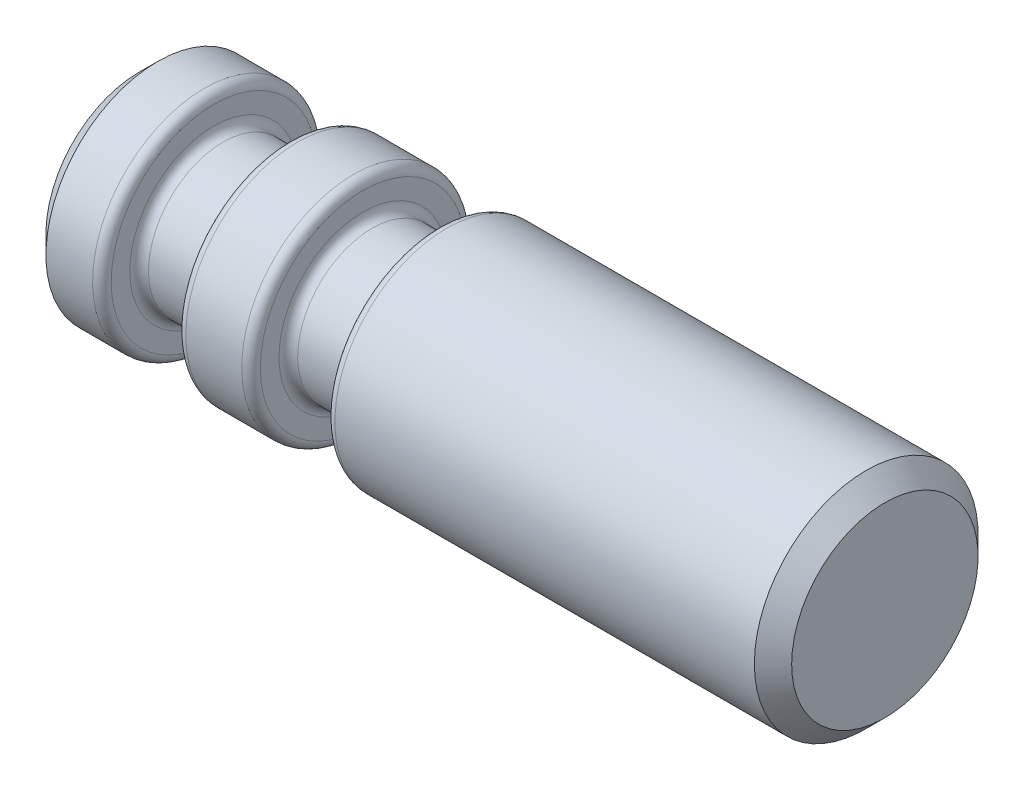
ISO-10303-21;
HEADER;
FILE_DESCRIPTION(('STEP AP214'),'2;1');
FILE_NAME('part.step','',(''),(''),'','','');
FILE_SCHEMA(('AUTOMOTIVE_DESIGN { 1 0 10303 214 1 1 1 1 }'));
ENDSEC;
DATA;
#1=APPLICATION_CONTEXT('core data for automotive mechanical design processes');
#2=APPLICATION_PROTOCOL_DEFINITION('international standard','automotive_design',2000,#1);
#3=PRODUCT_CONTEXT('',#1,'mechanical');
#4=PRODUCT('Part','Part','',(#3));
#5=PRODUCT_RELATED_PRODUCT_CATEGORY('part','',(#4));
#6=PRODUCT_DEFINITION_FORMATION('','',#4);
#7=PRODUCT_DEFINITION_CONTEXT('part definition',#1,'design');
#8=PRODUCT_DEFINITION('design','',#6,#7);
#9=PRODUCT_DEFINITION_SHAPE('','',#8);
#10=(LENGTH_UNIT() NAMED_UNIT(*) SI_UNIT(.MILLI.,.METRE.));
#11=(NAMED_UNIT(*) PLANE_ANGLE_UNIT() SI_UNIT($,.RADIAN.));
#12=(NAMED_UNIT(*) SI_UNIT($,.STERADIAN.) SOLID_ANGLE_UNIT());
#13=UNCERTAINTY_MEASURE_WITH_UNIT(LENGTH_MEASURE(1.E-05),#10,'distance_accuracy_value','');
#14=(GEOMETRIC_REPRESENTATION_CONTEXT(3) GLOBAL_UNCERTAINTY_ASSIGNED_CONTEXT((#13)) GLOBAL_UNIT_ASSIGNED_CONTEXT((#10,
#11,#12)) REPRESENTATION_CONTEXT('',''));
#15=CARTESIAN_POINT('',(0.,0.,0.));
#16=DIRECTION('',(0.,0.,1.));
#17=DIRECTION('',(1.,0.,0.));
#18=AXIS2_PLACEMENT_3D('',#15,#16,#17);
#19=CARTESIAN_POINT('',(0.,1.5,0.));
#20=DIRECTION('',(-1.,0.,0.));
#21=DIRECTION('',(0.,0.,1.));
#22=AXIS2_PLACEMENT_3D('',#19,#20,#21);
#23=PLANE('',#22);
#24=CARTESIAN_POINT('',(-2.27374217544318E-10,0.,0.));
#25=DIRECTION('',(1.,0.,0.));
#26=DIRECTION('',(0.,1.,0.));
#27=AXIS2_PLACEMENT_3D('',#24,#25,#26);
#28=CIRCLE('',#27,2.5000000002251);
#29=CARTESIAN_POINT('',(-2.27374849995586E-10,2.5000000002251,0.));
#30=VERTEX_POINT('',#29);
#31=EDGE_CURVE('E18',#30,#30,#28,.T.);
#32=ORIENTED_EDGE('',*,*,#31,.F.);
#33=EDGE_LOOP('',(#32));
#34=FACE_BOUND('',#33,.T.);
#35=ADVANCED_FACE('F15',(#34),#23,.T.);
#36=CARTESIAN_POINT('',(0.500000000215549,0.,0.));
#37=DIRECTION('',(1.,0.,0.));
#38=DIRECTION('',(0.,1.,0.));
#39=AXIS2_PLACEMENT_3D('',#36,#37,#38);
#40=CONICAL_SURFACE('',#39,2.99999999975853,0.785398162487954);
#41=CARTESIAN_POINT('',(0.500000000000001,0.,0.));
#42=DIRECTION('',(1.,0.,0.));
#43=DIRECTION('',(0.,1.,0.));
#44=AXIS2_PLACEMENT_3D('',#41,#42,#43);
#45=CIRCLE('',#44,3.);
#46=CARTESIAN_POINT('',(0.5,3.,0.));
#47=VERTEX_POINT('',#46);
#48=EDGE_CURVE('E235',#47,#47,#45,.T.);
#49=ORIENTED_EDGE('',*,*,#48,.F.);
#50=EDGE_LOOP('',(#49));
#51=FACE_BOUND('',#50,.T.);
#52=ORIENTED_EDGE('',*,*,#31,.T.);
#53=EDGE_LOOP('',(#52));
#54=FACE_BOUND('',#53,.T.);
#55=ADVANCED_FACE('F394',(#51,#54),#40,.T.);
#56=CARTESIAN_POINT('',(1.,0.,0.));
#57=DIRECTION('',(1.,0.,0.));
#58=DIRECTION('',(0.,1.,0.));
#59=AXIS2_PLACEMENT_3D('',#56,#57,#58);
#60=CYLINDRICAL_SURFACE('',#59,3.);
#61=CARTESIAN_POINT('',(1.75,0.,0.));
#62=DIRECTION('',(1.,0.,0.));
#63=DIRECTION('',(0.,0.,-1.));
#64=AXIS2_PLACEMENT_3D('',#61,#62,#63);
#65=CIRCLE('',#64,3.);
#66=CARTESIAN_POINT('',(1.75,0.,-3.));
#67=VERTEX_POINT('',#66);
#68=EDGE_CURVE('E221',#67,#67,#65,.T.);
#69=ORIENTED_EDGE('',*,*,#68,.F.);
#70=EDGE_LOOP('',(#69));
#71=FACE_BOUND('',#70,.T.);
#72=ORIENTED_EDGE('',*,*,#48,.T.);
#73=EDGE_LOOP('',(#72));
#74=FACE_BOUND('',#73,.T.);
#75=ADVANCED_FACE('F227',(#71,#74),#60,.T.);
#76=CARTESIAN_POINT('',(1.75,0.,0.));
#77=DIRECTION('',(1.,0.,0.));
#78=DIRECTION('',(0.,0.,-1.));
#79=AXIS2_PLACEMENT_3D('',#76,#77,#78);
#80=TOROIDAL_SURFACE('',#79,2.75,0.25);
#81=CARTESIAN_POINT('',(2.,0.,0.));
#82=DIRECTION('',(-1.,0.,0.));
#83=DIRECTION('',(0.,1.,0.));
#84=AXIS2_PLACEMENT_3D('',#81,#82,#83);
#85=CIRCLE('',#84,2.75);
#86=CARTESIAN_POINT('',(2.,2.75,0.));
#87=VERTEX_POINT('',#86);
#88=EDGE_CURVE('E424',#87,#87,#85,.F.);
#89=ORIENTED_EDGE('',*,*,#88,.F.);
#90=EDGE_LOOP('',(#89));
#91=FACE_BOUND('',#90,.T.);
#92=ORIENTED_EDGE('',*,*,#68,.T.);
#93=EDGE_LOOP('',(#92));
#94=FACE_BOUND('',#93,.T.);
#95=ADVANCED_FACE('F223',(#91,#94),#80,.T.);
#96=CARTESIAN_POINT('',(2.,2.5,0.));
#97=DIRECTION('',(1.,0.,0.));
#98=DIRECTION('',(0.,0.,-1.));
#99=AXIS2_PLACEMENT_3D('',#96,#97,#98);
#100=PLANE('',#99);
#101=CARTESIAN_POINT('',(2.,0.,0.));
#102=DIRECTION('',(1.,0.,0.));
#103=DIRECTION('',(0.,1.,0.));
#104=AXIS2_PLACEMENT_3D('',#101,#102,#103);
#105=CIRCLE('',#104,2.25);
#106=CARTESIAN_POINT('',(2.,2.25,0.));
#107=VERTEX_POINT('',#106);
#108=EDGE_CURVE('E192',#107,#107,#105,.F.);
#109=ORIENTED_EDGE('',*,*,#108,.T.);
#110=EDGE_LOOP('',(#109));
#111=FACE_BOUND('',#110,.T.);
#112=ORIENTED_EDGE('',*,*,#88,.T.);
#113=EDGE_LOOP('',(#112));
#114=FACE_BOUND('',#113,.T.);
#115=ADVANCED_FACE('F203',(#111,#114),#100,.T.);
#116=CARTESIAN_POINT('',(2.25,0.,0.));
#117=DIRECTION('',(1.,0.,0.));
#118=DIRECTION('',(0.,0.,-1.));
#119=AXIS2_PLACEMENT_3D('',#116,#117,#118);
#120=TOROIDAL_SURFACE('',#119,2.25,0.25);
#121=CARTESIAN_POINT('',(2.25,0.,0.));
#122=DIRECTION('',(1.,0.,0.));
#123=DIRECTION('',(0.,1.,0.));
#124=AXIS2_PLACEMENT_3D('',#121,#122,#123);
#125=CIRCLE('',#124,2.);
#126=CARTESIAN_POINT('',(2.25,2.,0.));
#127=VERTEX_POINT('',#126);
#128=EDGE_CURVE('E184',#127,#127,#125,.T.);
#129=ORIENTED_EDGE('',*,*,#128,.F.);
#130=EDGE_LOOP('',(#129));
#131=FACE_BOUND('',#130,.T.);
#132=ORIENTED_EDGE('',*,*,#108,.F.);
#133=EDGE_LOOP('',(#132));
#134=FACE_BOUND('',#133,.T.);
#135=ADVANCED_FACE('F199',(#131,#134),#120,.F.);
#136=CARTESIAN_POINT('',(3.,0.,0.));
#137=DIRECTION('',(1.,0.,0.));
#138=DIRECTION('',(0.,1.,0.));
#139=AXIS2_PLACEMENT_3D('',#136,#137,#138);
#140=CYLINDRICAL_SURFACE('',#139,2.);
#141=ORIENTED_EDGE('',*,*,#128,.T.);
#142=EDGE_LOOP('',(#141));
#143=FACE_BOUND('',#142,.T.);
#144=CARTESIAN_POINT('',(3.75,0.,0.));
#145=DIRECTION('',(1.,0.,0.));
#146=DIRECTION('',(0.,0.,-1.));
#147=AXIS2_PLACEMENT_3D('',#144,#145,#146);
#148=CIRCLE('',#147,2.);
#149=CARTESIAN_POINT('',(3.75,0.,-2.));
#150=VERTEX_POINT('',#149);
#151=EDGE_CURVE('E169',#150,#150,#148,.F.);
#152=ORIENTED_EDGE('',*,*,#151,.T.);
#153=EDGE_LOOP('',(#152));
#154=FACE_BOUND('',#153,.T.);
#155=ADVANCED_FACE('F175',(#143,#154),#140,.T.);
#156=CARTESIAN_POINT('',(3.75,0.,0.));
#157=DIRECTION('',(1.,0.,0.));
#158=DIRECTION('',(0.,0.,-1.));
#159=AXIS2_PLACEMENT_3D('',#156,#157,#158);
#160=TOROIDAL_SURFACE('',#159,2.25,0.25);
#161=CARTESIAN_POINT('',(4.,0.,0.));
#162=DIRECTION('',(-1.,0.,0.));
#163=DIRECTION('',(0.,1.,0.));
#164=AXIS2_PLACEMENT_3D('',#161,#162,#163);
#165=CIRCLE('',#164,2.25);
#166=CARTESIAN_POINT('',(4.,2.25,0.));
#167=VERTEX_POINT('',#166);
#168=EDGE_CURVE('E448',#167,#167,#165,.F.);
#169=ORIENTED_EDGE('',*,*,#168,.F.);
#170=EDGE_LOOP('',(#169));
#171=FACE_BOUND('',#170,.T.);
#172=ORIENTED_EDGE('',*,*,#151,.F.);
#173=EDGE_LOOP('',(#172));
#174=FACE_BOUND('',#173,.T.);
#175=ADVANCED_FACE('F171',(#171,#174),#160,.F.);
#176=CARTESIAN_POINT('',(4.,2.5,0.));
#177=DIRECTION('',(-1.,0.,0.));
#178=DIRECTION('',(0.,0.,1.));
#179=AXIS2_PLACEMENT_3D('',#176,#177,#178);
#180=PLANE('',#179);
#181=ORIENTED_EDGE('',*,*,#168,.T.);
#182=EDGE_LOOP('',(#181));
#183=FACE_BOUND('',#182,.T.);
#184=CARTESIAN_POINT('',(4.,0.,0.));
#185=DIRECTION('',(1.,0.,0.));
#186=DIRECTION('',(0.,1.,0.));
#187=AXIS2_PLACEMENT_3D('',#184,#185,#186);
#188=CIRCLE('',#187,2.75);
#189=CARTESIAN_POINT('',(4.,2.75,0.));
#190=VERTEX_POINT('',#189);
#191=EDGE_CURVE('E140',#190,#190,#188,.T.);
#192=ORIENTED_EDGE('',*,*,#191,.F.);
#193=EDGE_LOOP('',(#192));
#194=FACE_BOUND('',#193,.T.);
#195=ADVANCED_FACE('F151',(#183,#194),#180,.T.);
#196=CARTESIAN_POINT('',(4.25,0.,0.));
#197=DIRECTION('',(1.,0.,0.));
#198=DIRECTION('',(0.,0.,-1.));
#199=AXIS2_PLACEMENT_3D('',#196,#197,#198);
#200=TOROIDAL_SURFACE('',#199,2.75,0.25);
#201=CARTESIAN_POINT('',(4.25,0.,0.));
#202=DIRECTION('',(1.,0.,0.));
#203=DIRECTION('',(0.,1.,0.));
#204=AXIS2_PLACEMENT_3D('',#201,#202,#203);
#205=CIRCLE('',#204,3.);
#206=CARTESIAN_POINT('',(4.25,3.,0.));
#207=VERTEX_POINT('',#206);
#208=EDGE_CURVE('E132',#207,#207,#205,.T.);
#209=ORIENTED_EDGE('',*,*,#208,.F.);
#210=EDGE_LOOP('',(#209));
#211=FACE_BOUND('',#210,.T.);
#212=ORIENTED_EDGE('',*,*,#191,.T.);
#213=EDGE_LOOP('',(#212));
#214=FACE_BOUND('',#213,.T.);
#215=ADVANCED_FACE('F147',(#211,#214),#200,.T.);
#216=CARTESIAN_POINT('',(5.,0.,0.));
#217=DIRECTION('',(1.,0.,0.));
#218=DIRECTION('',(0.,1.,0.));
#219=AXIS2_PLACEMENT_3D('',#216,#217,#218);
#220=CYLINDRICAL_SURFACE('',#219,3.);
#221=ORIENTED_EDGE('',*,*,#208,.T.);
#222=EDGE_LOOP('',(#221));
#223=FACE_BOUND('',#222,.T.);
#224=CARTESIAN_POINT('',(5.75,0.,0.));
#225=DIRECTION('',(1.,0.,0.));
#226=DIRECTION('',(0.,0.,-1.));
#227=AXIS2_PLACEMENT_3D('',#224,#225,#226);
#228=CIRCLE('',#227,3.);
#229=CARTESIAN_POINT('',(5.75,0.,-3.));
#230=VERTEX_POINT('',#229);
#231=EDGE_CURVE('E117',#230,#230,#228,.T.);
#232=ORIENTED_EDGE('',*,*,#231,.F.);
#233=EDGE_LOOP('',(#232));
#234=FACE_BOUND('',#233,.T.);
#235=ADVANCED_FACE('F123',(#223,#234),#220,.T.);
#236=CARTESIAN_POINT('',(5.75,0.,0.));
#237=DIRECTION('',(1.,0.,0.));
#238=DIRECTION('',(0.,0.,-1.));
#239=AXIS2_PLACEMENT_3D('',#236,#237,#238);
#240=TOROIDAL_SURFACE('',#239,2.75,0.25);
#241=CARTESIAN_POINT('',(6.,0.,0.));
#242=DIRECTION('',(-1.,0.,0.));
#243=DIRECTION('',(0.,1.,0.));
#244=AXIS2_PLACEMENT_3D('',#241,#242,#243);
#245=CIRCLE('',#244,2.75);
#246=CARTESIAN_POINT('',(6.,2.75,0.));
#247=VERTEX_POINT('',#246);
#248=EDGE_CURVE('E472',#247,#247,#245,.F.);
#249=ORIENTED_EDGE('',*,*,#248,.F.);
#250=EDGE_LOOP('',(#249));
#251=FACE_BOUND('',#250,.T.);
#252=ORIENTED_EDGE('',*,*,#231,.T.);
#253=EDGE_LOOP('',(#252));
#254=FACE_BOUND('',#253,.T.);
#255=ADVANCED_FACE('F119',(#251,#254),#240,.T.);
#256=CARTESIAN_POINT('',(6.,2.5,0.));
#257=DIRECTION('',(1.,0.,0.));
#258=DIRECTION('',(0.,0.,-1.));
#259=AXIS2_PLACEMENT_3D('',#256,#257,#258);
#260=PLANE('',#259);
#261=CARTESIAN_POINT('',(6.,0.,0.));
#262=DIRECTION('',(1.,0.,0.));
#263=DIRECTION('',(0.,1.,0.));
#264=AXIS2_PLACEMENT_3D('',#261,#262,#263);
#265=CIRCLE('',#264,2.25);
#266=CARTESIAN_POINT('',(6.,2.25,0.));
#267=VERTEX_POINT('',#266);
#268=EDGE_CURVE('E88',#267,#267,#265,.F.);
#269=ORIENTED_EDGE('',*,*,#268,.T.);
#270=EDGE_LOOP('',(#269));
#271=FACE_BOUND('',#270,.T.);
#272=ORIENTED_EDGE('',*,*,#248,.T.);
#273=EDGE_LOOP('',(#272));
#274=FACE_BOUND('',#273,.T.);
#275=ADVANCED_FACE('F99',(#271,#274),#260,.T.);
#276=CARTESIAN_POINT('',(6.25,0.,0.));
#277=DIRECTION('',(1.,0.,0.));
#278=DIRECTION('',(0.,0.,-1.));
#279=AXIS2_PLACEMENT_3D('',#276,#277,#278);
#280=TOROIDAL_SURFACE('',#279,2.25,0.25);
#281=CARTESIAN_POINT('',(6.25,0.,0.));
#282=DIRECTION('',(1.,0.,0.));
#283=DIRECTION('',(0.,1.,0.));
#284=AXIS2_PLACEMENT_3D('',#281,#282,#283);
#285=CIRCLE('',#284,2.);
#286=CARTESIAN_POINT('',(6.25,2.,0.));
#287=VERTEX_POINT('',#286);
#288=EDGE_CURVE('E80',#287,#287,#285,.T.);
#289=ORIENTED_EDGE('',*,*,#288,.F.);
#290=EDGE_LOOP('',(#289));
#291=FACE_BOUND('',#290,.T.);
#292=ORIENTED_EDGE('',*,*,#268,.F.);
#293=EDGE_LOOP('',(#292));
#294=FACE_BOUND('',#293,.T.);
#295=ADVANCED_FACE('F95',(#291,#294),#280,.F.);
#296=CARTESIAN_POINT('',(7.,0.,0.));
#297=DIRECTION('',(1.,0.,0.));
#298=DIRECTION('',(0.,1.,0.));
#299=AXIS2_PLACEMENT_3D('',#296,#297,#298);
#300=CYLINDRICAL_SURFACE('',#299,2.);
#301=ORIENTED_EDGE('',*,*,#288,.T.);
#302=EDGE_LOOP('',(#301));
#303=FACE_BOUND('',#302,.T.);
#304=CARTESIAN_POINT('',(7.75,0.,0.));
#305=DIRECTION('',(1.,0.,0.));
#306=DIRECTION('',(0.,0.,-1.));
#307=AXIS2_PLACEMENT_3D('',#304,#305,#306);
#308=CIRCLE('',#307,2.);
#309=CARTESIAN_POINT('',(7.75,0.,-2.));
#310=VERTEX_POINT('',#309);
#311=EDGE_CURVE('E62',#310,#310,#308,.F.);
#312=ORIENTED_EDGE('',*,*,#311,.T.);
#313=EDGE_LOOP('',(#312));
#314=FACE_BOUND('',#313,.T.);
#315=ADVANCED_FACE('F71',(#303,#314),#300,.T.);
#316=CARTESIAN_POINT('',(7.75,0.,0.));
#317=DIRECTION('',(1.,0.,0.));
#318=DIRECTION('',(0.,0.,-1.));
#319=AXIS2_PLACEMENT_3D('',#316,#317,#318);
#320=TOROIDAL_SURFACE('',#319,2.25,0.25);
#321=CARTESIAN_POINT('',(8.,0.,0.));
#322=DIRECTION('',(-1.,0.,0.));
#323=DIRECTION('',(0.,1.,0.));
#324=AXIS2_PLACEMENT_3D('',#321,#322,#323);
#325=CIRCLE('',#324,2.25);
#326=CARTESIAN_POINT('',(8.,2.25,0.));
#327=VERTEX_POINT('',#326);
#328=EDGE_CURVE('E246',#327,#327,#325,.F.);
#329=ORIENTED_EDGE('',*,*,#328,.F.);
#330=EDGE_LOOP('',(#329));
#331=FACE_BOUND('',#330,.T.);
#332=ORIENTED_EDGE('',*,*,#311,.F.);
#333=EDGE_LOOP('',(#332));
#334=FACE_BOUND('',#333,.T.);
#335=ADVANCED_FACE('F65',(#331,#334),#320,.F.);
#336=CARTESIAN_POINT('',(20.,1.50000000000001,0.));
#337=DIRECTION('',(1.,0.,0.));
#338=DIRECTION('',(0.,0.,-1.));
#339=AXIS2_PLACEMENT_3D('',#336,#337,#338);
#340=PLANE('',#339);
#341=CARTESIAN_POINT('',(20.000000000266,0.,0.));
#342=DIRECTION('',(-1.,0.,0.));
#343=DIRECTION('',(0.,0.,1.));
#344=AXIS2_PLACEMENT_3D('',#341,#342,#343);
#345=CIRCLE('',#344,2.50000000016826);
#346=CARTESIAN_POINT('',(20.000000000266,0.,2.50000000016826));
#347=VERTEX_POINT('',#346);
#348=EDGE_CURVE('E244',#347,#347,#345,.T.);
#349=ORIENTED_EDGE('',*,*,#348,.F.);
#350=EDGE_LOOP('',(#349));
#351=FACE_BOUND('',#350,.T.);
#352=ADVANCED_FACE('F70',(#351),#340,.T.);
#353=CARTESIAN_POINT('',(8.,2.5,0.));
#354=DIRECTION('',(-1.,0.,0.));
#355=DIRECTION('',(0.,0.,1.));
#356=AXIS2_PLACEMENT_3D('',#353,#354,#355);
#357=PLANE('',#356);
#358=ORIENTED_EDGE('',*,*,#328,.T.);
#359=EDGE_LOOP('',(#358));
#360=FACE_BOUND('',#359,.T.);
#361=CARTESIAN_POINT('',(8.,0.,0.));
#362=DIRECTION('',(1.,0.,0.));
#363=DIRECTION('',(0.,1.,0.));
#364=AXIS2_PLACEMENT_3D('',#361,#362,#363);
#365=CIRCLE('',#364,2.75);
#366=CARTESIAN_POINT('',(8.,2.75,0.));
#367=VERTEX_POINT('',#366);
#368=EDGE_CURVE('E27',#367,#367,#365,.T.);
#369=ORIENTED_EDGE('',*,*,#368,.F.);
#370=EDGE_LOOP('',(#369));
#371=FACE_BOUND('',#370,.T.);
#372=ADVANCED_FACE('F268',(#360,#371),#357,.T.);
#373=CARTESIAN_POINT('',(19.4999999998231,0.,0.));
#374=DIRECTION('',(-1.,0.,0.));
#375=DIRECTION('',(0.,0.,1.));
#376=AXIS2_PLACEMENT_3D('',#373,#374,#375);
#377=CONICAL_SURFACE('',#376,2.99999999975853,0.785398162544797);
#378=ORIENTED_EDGE('',*,*,#348,.T.);
#379=EDGE_LOOP('',(#378));
#380=FACE_BOUND('',#379,.T.);
#381=CARTESIAN_POINT('',(19.5,0.,0.));
#382=DIRECTION('',(1.,0.,0.));
#383=DIRECTION('',(0.,1.,0.));
#384=AXIS2_PLACEMENT_3D('',#381,#382,#383);
#385=CIRCLE('',#384,3.);
#386=CARTESIAN_POINT('',(19.5,3.00000000000001,0.));
#387=VERTEX_POINT('',#386);
#388=EDGE_CURVE('E22',#387,#387,#385,.F.);
#389=ORIENTED_EDGE('',*,*,#388,.F.);
#390=EDGE_LOOP('',(#389));
#391=FACE_BOUND('',#390,.T.);
#392=ADVANCED_FACE('F45',(#380,#391),#377,.T.);
#393=CARTESIAN_POINT('',(8.25,0.,0.));
#394=DIRECTION('',(1.,0.,0.));
#395=DIRECTION('',(0.,0.,-1.));
#396=AXIS2_PLACEMENT_3D('',#393,#394,#395);
#397=TOROIDAL_SURFACE('',#396,2.75,0.25);
#398=CARTESIAN_POINT('',(8.25,0.,0.));
#399=DIRECTION('',(1.,0.,0.));
#400=DIRECTION('',(0.,1.,0.));
#401=AXIS2_PLACEMENT_3D('',#398,#399,#400);
#402=CIRCLE('',#401,3.);
#403=CARTESIAN_POINT('',(8.25,3.,0.));
#404=VERTEX_POINT('',#403);
#405=EDGE_CURVE('E10',#404,#404,#402,.T.);
#406=ORIENTED_EDGE('',*,*,#405,.F.);
#407=EDGE_LOOP('',(#406));
#408=FACE_BOUND('',#407,.T.);
#409=ORIENTED_EDGE('',*,*,#368,.T.);
#410=EDGE_LOOP('',(#409));
#411=FACE_BOUND('',#410,.T.);
#412=ADVANCED_FACE('F39',(#408,#411),#397,.T.);
#413=CARTESIAN_POINT('',(14.,0.,0.));
#414=DIRECTION('',(1.,0.,0.));
#415=DIRECTION('',(0.,1.,0.));
#416=AXIS2_PLACEMENT_3D('',#413,#414,#415);
#417=CYLINDRICAL_SURFACE('',#416,3.);
#418=ORIENTED_EDGE('',*,*,#405,.T.);
#419=EDGE_LOOP('',(#418));
#420=FACE_BOUND('',#419,.T.);
#421=ORIENTED_EDGE('',*,*,#388,.T.);
#422=EDGE_LOOP('',(#421));
#423=FACE_BOUND('',#422,.T.);
#424=ADVANCED_FACE('F44',(#420,#423),#417,.T.);
#425=CLOSED_SHELL('',(#35,#55,#75,#95,#115,#135,#155,#175,#195,#215,#235,#255,#275,#295,#315,
#335,#352,#372,#392,#412,#424));
#426=MANIFOLD_SOLID_BREP('B1',#425);
#427=ADVANCED_BREP_SHAPE_REPRESENTATION('',(#18,#426),#14);
#428=SHAPE_DEFINITION_REPRESENTATION(#9,#427);
ENDSEC;
END-ISO-10303-21;
